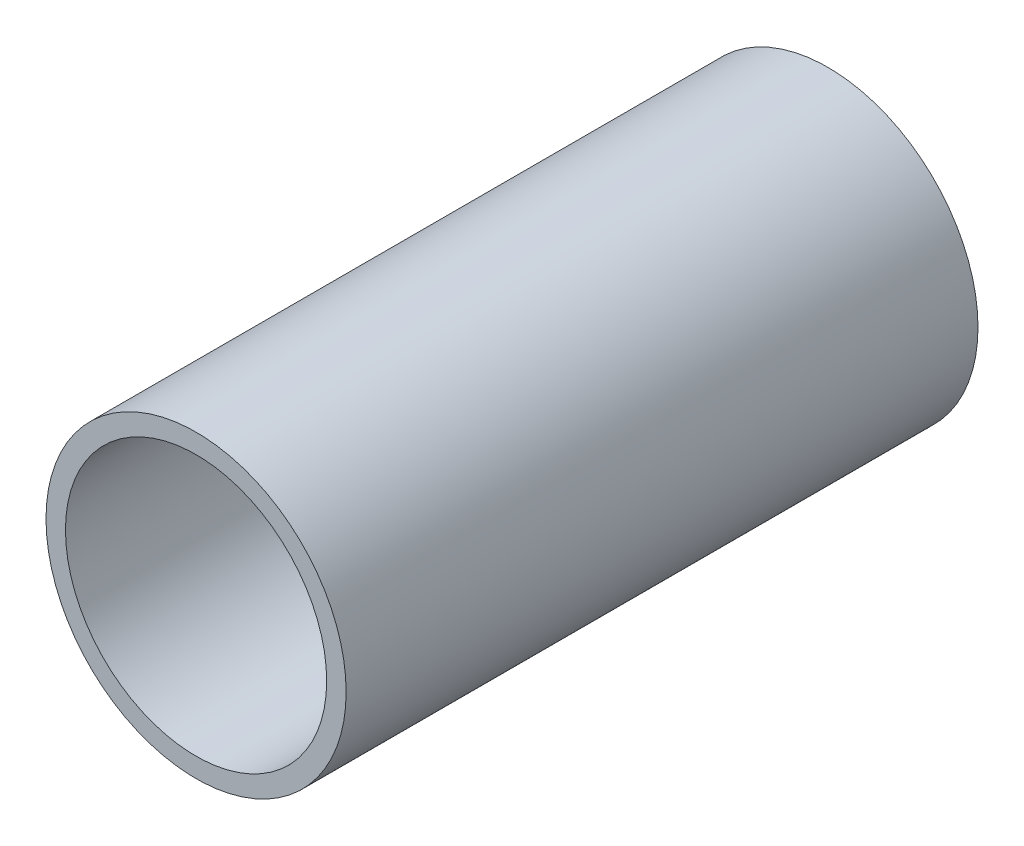
ISO-10303-21;
HEADER;
FILE_DESCRIPTION(('STEP AP214'),'2;1');
FILE_NAME('part.step','',(''),(''),'','','');
FILE_SCHEMA(('AUTOMOTIVE_DESIGN { 1 0 10303 214 1 1 1 1 }'));
ENDSEC;
DATA;
#1=APPLICATION_CONTEXT('core data for automotive mechanical design processes');
#2=APPLICATION_PROTOCOL_DEFINITION('international standard','automotive_design',2000,#1);
#3=PRODUCT_CONTEXT('',#1,'mechanical');
#4=PRODUCT('Part','Part','',(#3));
#5=PRODUCT_RELATED_PRODUCT_CATEGORY('part','',(#4));
#6=PRODUCT_DEFINITION_FORMATION('','',#4);
#7=PRODUCT_DEFINITION_CONTEXT('part definition',#1,'design');
#8=PRODUCT_DEFINITION('design','',#6,#7);
#9=PRODUCT_DEFINITION_SHAPE('','',#8);
#10=(LENGTH_UNIT() NAMED_UNIT(*) SI_UNIT(.MILLI.,.METRE.));
#11=(NAMED_UNIT(*) PLANE_ANGLE_UNIT() SI_UNIT($,.RADIAN.));
#12=(NAMED_UNIT(*) SI_UNIT($,.STERADIAN.) SOLID_ANGLE_UNIT());
#13=UNCERTAINTY_MEASURE_WITH_UNIT(LENGTH_MEASURE(1.E-05),#10,'distance_accuracy_value','');
#14=(GEOMETRIC_REPRESENTATION_CONTEXT(3) GLOBAL_UNCERTAINTY_ASSIGNED_CONTEXT((#13)) GLOBAL_UNIT_ASSIGNED_CONTEXT((#10,
#11,#12)) REPRESENTATION_CONTEXT('',''));
#15=CARTESIAN_POINT('',(0.,0.,0.));
#16=DIRECTION('',(0.,0.,1.));
#17=DIRECTION('',(1.,0.,0.));
#18=AXIS2_PLACEMENT_3D('',#15,#16,#17);
#19=CARTESIAN_POINT('',(0.,0.,127.));
#20=DIRECTION('',(0.,0.,1.));
#21=DIRECTION('',(1.,0.,0.));
#22=AXIS2_PLACEMENT_3D('',#19,#20,#21);
#23=PLANE('',#22);
#24=CARTESIAN_POINT('',(0.,0.,127.));
#25=DIRECTION('',(0.,0.,1.));
#26=DIRECTION('',(1.,0.,0.));
#27=AXIS2_PLACEMENT_3D('',#24,#25,#26);
#28=CIRCLE('',#27,30.1625);
#29=CARTESIAN_POINT('',(30.1625,0.,127.));
#30=VERTEX_POINT('',#29);
#31=EDGE_CURVE('E10',#30,#30,#28,.T.);
#32=ORIENTED_EDGE('',*,*,#31,.T.);
#33=EDGE_LOOP('',(#32));
#34=FACE_BOUND('',#33,.T.);
#35=CARTESIAN_POINT('',(0.,0.,127.));
#36=DIRECTION('',(0.,0.,1.));
#37=DIRECTION('',(1.,0.,0.));
#38=AXIS2_PLACEMENT_3D('',#35,#36,#37);
#39=CIRCLE('',#38,26.2509);
#40=CARTESIAN_POINT('',(26.2509,0.,127.));
#41=VERTEX_POINT('',#40);
#42=EDGE_CURVE('E54',#41,#41,#39,.T.);
#43=ORIENTED_EDGE('',*,*,#42,.F.);
#44=EDGE_LOOP('',(#43));
#45=FACE_BOUND('',#44,.T.);
#46=ADVANCED_FACE('F41',(#34,#45),#23,.T.);
#47=CARTESIAN_POINT('',(0.,0.,0.));
#48=DIRECTION('',(0.,0.,1.));
#49=DIRECTION('',(1.,0.,0.));
#50=AXIS2_PLACEMENT_3D('',#47,#48,#49);
#51=PLANE('',#50);
#52=CARTESIAN_POINT('',(0.,0.,0.));
#53=DIRECTION('',(0.,0.,1.));
#54=DIRECTION('',(1.,0.,0.));
#55=AXIS2_PLACEMENT_3D('',#52,#53,#54);
#56=CIRCLE('',#55,30.1625);
#57=CARTESIAN_POINT('',(30.1625,0.,0.));
#58=VERTEX_POINT('',#57);
#59=EDGE_CURVE('E45',#58,#58,#56,.T.);
#60=ORIENTED_EDGE('',*,*,#59,.F.);
#61=EDGE_LOOP('',(#60));
#62=FACE_BOUND('',#61,.T.);
#63=CARTESIAN_POINT('',(0.,0.,0.));
#64=DIRECTION('',(0.,0.,1.));
#65=DIRECTION('',(1.,0.,0.));
#66=AXIS2_PLACEMENT_3D('',#63,#64,#65);
#67=CIRCLE('',#66,26.2509);
#68=CARTESIAN_POINT('',(26.2509,0.,0.));
#69=VERTEX_POINT('',#68);
#70=EDGE_CURVE('E56',#69,#69,#67,.T.);
#71=ORIENTED_EDGE('',*,*,#70,.T.);
#72=EDGE_LOOP('',(#71));
#73=FACE_BOUND('',#72,.T.);
#74=ADVANCED_FACE('F68',(#62,#73),#51,.F.);
#75=CARTESIAN_POINT('',(0.,0.,127.));
#76=DIRECTION('',(0.,0.,-1.));
#77=DIRECTION('',(-1.,0.,0.));
#78=AXIS2_PLACEMENT_3D('',#75,#76,#77);
#79=CYLINDRICAL_SURFACE('',#78,30.1625);
#80=ORIENTED_EDGE('',*,*,#31,.F.);
#81=EDGE_LOOP('',(#80));
#82=FACE_BOUND('',#81,.T.);
#83=ORIENTED_EDGE('',*,*,#59,.T.);
#84=EDGE_LOOP('',(#83));
#85=FACE_BOUND('',#84,.T.);
#86=ADVANCED_FACE('F43',(#82,#85),#79,.T.);
#87=CARTESIAN_POINT('',(0.,0.,127.));
#88=DIRECTION('',(0.,0.,-1.));
#89=DIRECTION('',(-1.,0.,0.));
#90=AXIS2_PLACEMENT_3D('',#87,#88,#89);
#91=CYLINDRICAL_SURFACE('',#90,26.2509);
#92=ORIENTED_EDGE('',*,*,#42,.T.);
#93=EDGE_LOOP('',(#92));
#94=FACE_BOUND('',#93,.T.);
#95=ORIENTED_EDGE('',*,*,#70,.F.);
#96=EDGE_LOOP('',(#95));
#97=FACE_BOUND('',#96,.T.);
#98=ADVANCED_FACE('F64',(#94,#97),#91,.F.);
#99=CLOSED_SHELL('',(#46,#74,#86,#98));
#100=MANIFOLD_SOLID_BREP('B2',#99);
#101=ADVANCED_BREP_SHAPE_REPRESENTATION('',(#18,#100),#14);
#102=SHAPE_DEFINITION_REPRESENTATION(#9,#101);
ENDSEC;
END-ISO-10303-21;
